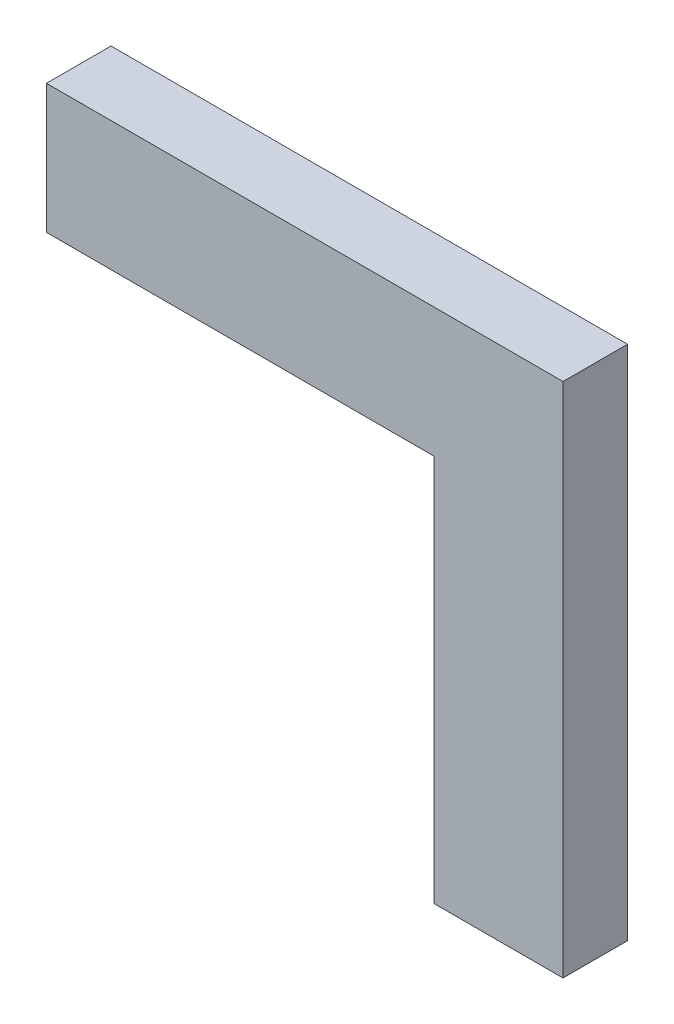
ISO-10303-21;
HEADER;
FILE_DESCRIPTION(('STEP AP214'),'2;1');
FILE_NAME('part.step','',(''),(''),'','','');
FILE_SCHEMA(('AUTOMOTIVE_DESIGN { 1 0 10303 214 1 1 1 1 }'));
ENDSEC;
DATA;
#1=APPLICATION_CONTEXT('core data for automotive mechanical design processes');
#2=APPLICATION_PROTOCOL_DEFINITION('international standard','automotive_design',2000,#1);
#3=PRODUCT_CONTEXT('',#1,'mechanical');
#4=PRODUCT('Part','Part','',(#3));
#5=PRODUCT_RELATED_PRODUCT_CATEGORY('part','',(#4));
#6=PRODUCT_DEFINITION_FORMATION('','',#4);
#7=PRODUCT_DEFINITION_CONTEXT('part definition',#1,'design');
#8=PRODUCT_DEFINITION('design','',#6,#7);
#9=PRODUCT_DEFINITION_SHAPE('','',#8);
#10=(LENGTH_UNIT() NAMED_UNIT(*) SI_UNIT(.MILLI.,.METRE.));
#11=(NAMED_UNIT(*) PLANE_ANGLE_UNIT() SI_UNIT($,.RADIAN.));
#12=(NAMED_UNIT(*) SI_UNIT($,.STERADIAN.) SOLID_ANGLE_UNIT());
#13=UNCERTAINTY_MEASURE_WITH_UNIT(LENGTH_MEASURE(1.E-05),#10,'distance_accuracy_value','');
#14=(GEOMETRIC_REPRESENTATION_CONTEXT(3) GLOBAL_UNCERTAINTY_ASSIGNED_CONTEXT((#13)) GLOBAL_UNIT_ASSIGNED_CONTEXT((#10,
#11,#12)) REPRESENTATION_CONTEXT('',''));
#15=CARTESIAN_POINT('',(0.,0.,0.));
#16=DIRECTION('',(0.,0.,1.));
#17=DIRECTION('',(1.,0.,0.));
#18=AXIS2_PLACEMENT_3D('',#15,#16,#17);
#19=CARTESIAN_POINT('',(-76.2,25.4,25.4));
#20=DIRECTION('',(1.,0.,0.));
#21=DIRECTION('',(0.,0.,-1.));
#22=AXIS2_PLACEMENT_3D('',#19,#20,#21);
#23=PLANE('',#22);
#24=DIRECTION('',(0.,-1.,0.));
#25=VECTOR('',#24,1.);
#26=CARTESIAN_POINT('',(-76.2,25.4,0.));
#27=LINE('',#26,#25);
#28=CARTESIAN_POINT('',(-76.2,25.4,0.));
#29=VERTEX_POINT('',#28);
#30=CARTESIAN_POINT('',(-76.2,-25.4,0.));
#31=VERTEX_POINT('',#30);
#32=EDGE_CURVE('E136',#29,#31,#27,.T.);
#33=ORIENTED_EDGE('',*,*,#32,.T.);
#34=DIRECTION('',(0.,0.,-1.));
#35=VECTOR('',#34,1.);
#36=CARTESIAN_POINT('',(-76.2,-25.4,25.4));
#37=LINE('',#36,#35);
#38=CARTESIAN_POINT('',(-76.2,-25.4,25.4));
#39=VERTEX_POINT('',#38);
#40=EDGE_CURVE('E11',#39,#31,#37,.T.);
#41=ORIENTED_EDGE('',*,*,#40,.F.);
#42=DIRECTION('',(0.,-1.,0.));
#43=VECTOR('',#42,1.);
#44=CARTESIAN_POINT('',(-76.2,25.4,25.4));
#45=LINE('',#44,#43);
#46=CARTESIAN_POINT('',(-76.2,25.4,25.4));
#47=VERTEX_POINT('',#46);
#48=EDGE_CURVE('E152',#47,#39,#45,.T.);
#49=ORIENTED_EDGE('',*,*,#48,.F.);
#50=DIRECTION('',(0.,0.,-1.));
#51=VECTOR('',#50,1.);
#52=CARTESIAN_POINT('',(-76.2,25.4,25.4));
#53=LINE('',#52,#51);
#54=EDGE_CURVE('E92',#47,#29,#53,.T.);
#55=ORIENTED_EDGE('',*,*,#54,.T.);
#56=EDGE_LOOP('',(#33,#41,#49,#55));
#57=FACE_BOUND('',#56,.T.);
#58=ADVANCED_FACE('F44',(#57),#23,.F.);
#59=CARTESIAN_POINT('',(-76.2,-25.4,25.4));
#60=DIRECTION('',(0.,1.,0.));
#61=DIRECTION('',(0.,0.,1.));
#62=AXIS2_PLACEMENT_3D('',#59,#60,#61);
#63=PLANE('',#62);
#64=DIRECTION('',(1.,0.,0.));
#65=VECTOR('',#64,1.);
#66=CARTESIAN_POINT('',(-76.2,-25.4,0.));
#67=LINE('',#66,#65);
#68=CARTESIAN_POINT('',(76.2,-25.4,0.));
#69=VERTEX_POINT('',#68);
#70=EDGE_CURVE('E139',#31,#69,#67,.T.);
#71=ORIENTED_EDGE('',*,*,#70,.T.);
#72=DIRECTION('',(0.,0.,-1.));
#73=VECTOR('',#72,1.);
#74=CARTESIAN_POINT('',(76.2,-25.4,25.4));
#75=LINE('',#74,#73);
#76=CARTESIAN_POINT('',(76.2,-25.4,25.4));
#77=VERTEX_POINT('',#76);
#78=EDGE_CURVE('E53',#77,#69,#75,.T.);
#79=ORIENTED_EDGE('',*,*,#78,.F.);
#80=DIRECTION('',(1.,0.,0.));
#81=VECTOR('',#80,1.);
#82=CARTESIAN_POINT('',(-76.2,-25.4,25.4));
#83=LINE('',#82,#81);
#84=EDGE_CURVE('E99',#39,#77,#83,.T.);
#85=ORIENTED_EDGE('',*,*,#84,.F.);
#86=ORIENTED_EDGE('',*,*,#40,.T.);
#87=EDGE_LOOP('',(#71,#79,#85,#86));
#88=FACE_BOUND('',#87,.T.);
#89=ADVANCED_FACE('F165',(#88),#63,.F.);
#90=CARTESIAN_POINT('',(76.2,-25.4,25.4));
#91=DIRECTION('',(1.,0.,0.));
#92=DIRECTION('',(0.,1.,0.));
#93=AXIS2_PLACEMENT_3D('',#90,#91,#92);
#94=PLANE('',#93);
#95=DIRECTION('',(0.,-1.,0.));
#96=VECTOR('',#95,1.);
#97=CARTESIAN_POINT('',(76.2,-25.4,0.));
#98=LINE('',#97,#96);
#99=CARTESIAN_POINT('',(76.2,-177.8,0.));
#100=VERTEX_POINT('',#99);
#101=EDGE_CURVE('E142',#69,#100,#98,.T.);
#102=ORIENTED_EDGE('',*,*,#101,.T.);
#103=DIRECTION('',(0.,0.,-1.));
#104=VECTOR('',#103,1.);
#105=CARTESIAN_POINT('',(76.2,-177.8,25.4));
#106=LINE('',#105,#104);
#107=CARTESIAN_POINT('',(76.2,-177.8,25.4));
#108=VERTEX_POINT('',#107);
#109=EDGE_CURVE('E126',#108,#100,#106,.T.);
#110=ORIENTED_EDGE('',*,*,#109,.F.);
#111=DIRECTION('',(0.,-1.,0.));
#112=VECTOR('',#111,1.);
#113=CARTESIAN_POINT('',(76.2,-25.4,25.4));
#114=LINE('',#113,#112);
#115=EDGE_CURVE('E112',#77,#108,#114,.T.);
#116=ORIENTED_EDGE('',*,*,#115,.F.);
#117=ORIENTED_EDGE('',*,*,#78,.T.);
#118=EDGE_LOOP('',(#102,#110,#116,#117));
#119=FACE_BOUND('',#118,.T.);
#120=ADVANCED_FACE('F162',(#119),#94,.F.);
#121=CARTESIAN_POINT('',(76.2,-177.8,25.4));
#122=DIRECTION('',(0.,1.,0.));
#123=DIRECTION('',(-1.,0.,0.));
#124=AXIS2_PLACEMENT_3D('',#121,#122,#123);
#125=PLANE('',#124);
#126=DIRECTION('',(1.,0.,0.));
#127=VECTOR('',#126,1.);
#128=CARTESIAN_POINT('',(76.2,-177.8,0.));
#129=LINE('',#128,#127);
#130=CARTESIAN_POINT('',(127.,-177.8,0.));
#131=VERTEX_POINT('',#130);
#132=EDGE_CURVE('E122',#100,#131,#129,.T.);
#133=ORIENTED_EDGE('',*,*,#132,.T.);
#134=DIRECTION('',(0.,0.,-1.));
#135=VECTOR('',#134,1.);
#136=CARTESIAN_POINT('',(127.,-177.8,25.4));
#137=LINE('',#136,#135);
#138=CARTESIAN_POINT('',(127.,-177.8,25.4));
#139=VERTEX_POINT('',#138);
#140=EDGE_CURVE('E119',#139,#131,#137,.T.);
#141=ORIENTED_EDGE('',*,*,#140,.F.);
#142=DIRECTION('',(1.,0.,0.));
#143=VECTOR('',#142,1.);
#144=CARTESIAN_POINT('',(76.2,-177.8,25.4));
#145=LINE('',#144,#143);
#146=EDGE_CURVE('E106',#108,#139,#145,.T.);
#147=ORIENTED_EDGE('',*,*,#146,.F.);
#148=ORIENTED_EDGE('',*,*,#109,.T.);
#149=EDGE_LOOP('',(#133,#141,#147,#148));
#150=FACE_BOUND('',#149,.T.);
#151=ADVANCED_FACE('F120',(#150),#125,.F.);
#152=CARTESIAN_POINT('',(127.,25.4,25.4));
#153=DIRECTION('',(1.,0.,0.));
#154=DIRECTION('',(0.,1.,0.));
#155=AXIS2_PLACEMENT_3D('',#152,#153,#154);
#156=PLANE('',#155);
#157=DIRECTION('',(0.,-1.,0.));
#158=VECTOR('',#157,1.);
#159=CARTESIAN_POINT('',(127.,25.4,0.));
#160=LINE('',#159,#158);
#161=CARTESIAN_POINT('',(127.,25.4,0.));
#162=VERTEX_POINT('',#161);
#163=EDGE_CURVE('E147',#162,#131,#160,.T.);
#164=ORIENTED_EDGE('',*,*,#163,.F.);
#165=DIRECTION('',(0.,0.,-1.));
#166=VECTOR('',#165,1.);
#167=CARTESIAN_POINT('',(127.,25.4,25.4));
#168=LINE('',#167,#166);
#169=CARTESIAN_POINT('',(127.,25.4,25.4));
#170=VERTEX_POINT('',#169);
#171=EDGE_CURVE('E127',#170,#162,#168,.T.);
#172=ORIENTED_EDGE('',*,*,#171,.F.);
#173=DIRECTION('',(0.,-1.,0.));
#174=VECTOR('',#173,1.);
#175=CARTESIAN_POINT('',(127.,25.4,25.4));
#176=LINE('',#175,#174);
#177=EDGE_CURVE('E110',#170,#139,#176,.T.);
#178=ORIENTED_EDGE('',*,*,#177,.T.);
#179=ORIENTED_EDGE('',*,*,#140,.T.);
#180=EDGE_LOOP('',(#164,#172,#178,#179));
#181=FACE_BOUND('',#180,.T.);
#182=ADVANCED_FACE('F129',(#181),#156,.T.);
#183=CARTESIAN_POINT('',(-76.2,25.4,25.4));
#184=DIRECTION('',(0.,1.,0.));
#185=DIRECTION('',(0.,0.,1.));
#186=AXIS2_PLACEMENT_3D('',#183,#184,#185);
#187=PLANE('',#186);
#188=DIRECTION('',(1.,0.,0.));
#189=VECTOR('',#188,1.);
#190=CARTESIAN_POINT('',(-76.2,25.4,0.));
#191=LINE('',#190,#189);
#192=EDGE_CURVE('E85',#29,#162,#191,.T.);
#193=ORIENTED_EDGE('',*,*,#192,.F.);
#194=ORIENTED_EDGE('',*,*,#54,.F.);
#195=DIRECTION('',(1.,0.,0.));
#196=VECTOR('',#195,1.);
#197=CARTESIAN_POINT('',(76.2,25.4,25.4));
#198=LINE('',#197,#196);
#199=EDGE_CURVE('E61',#47,#170,#198,.T.);
#200=ORIENTED_EDGE('',*,*,#199,.T.);
#201=ORIENTED_EDGE('',*,*,#171,.T.);
#202=EDGE_LOOP('',(#193,#194,#200,#201));
#203=FACE_BOUND('',#202,.T.);
#204=ADVANCED_FACE('F179',(#203),#187,.T.);
#205=CARTESIAN_POINT('',(0.,0.,25.4));
#206=DIRECTION('',(0.,0.,1.));
#207=DIRECTION('',(1.,0.,0.));
#208=AXIS2_PLACEMENT_3D('',#205,#206,#207);
#209=PLANE('',#208);
#210=ORIENTED_EDGE('',*,*,#48,.T.);
#211=ORIENTED_EDGE('',*,*,#84,.T.);
#212=ORIENTED_EDGE('',*,*,#115,.T.);
#213=ORIENTED_EDGE('',*,*,#146,.T.);
#214=ORIENTED_EDGE('',*,*,#177,.F.);
#215=ORIENTED_EDGE('',*,*,#199,.F.);
#216=EDGE_LOOP('',(#210,#211,#212,#213,#214,#215));
#217=FACE_BOUND('',#216,.T.);
#218=ADVANCED_FACE('F108',(#217),#209,.T.);
#219=CARTESIAN_POINT('',(0.,0.,0.));
#220=DIRECTION('',(0.,0.,1.));
#221=DIRECTION('',(1.,0.,0.));
#222=AXIS2_PLACEMENT_3D('',#219,#220,#221);
#223=PLANE('',#222);
#224=ORIENTED_EDGE('',*,*,#32,.F.);
#225=ORIENTED_EDGE('',*,*,#192,.T.);
#226=ORIENTED_EDGE('',*,*,#163,.T.);
#227=ORIENTED_EDGE('',*,*,#132,.F.);
#228=ORIENTED_EDGE('',*,*,#101,.F.);
#229=ORIENTED_EDGE('',*,*,#70,.F.);
#230=EDGE_LOOP('',(#224,#225,#226,#227,#228,#229));
#231=FACE_BOUND('',#230,.T.);
#232=ADVANCED_FACE('F163',(#231),#223,.F.);
#233=CLOSED_SHELL('',(#58,#89,#120,#151,#182,#204,#218,#232));
#234=MANIFOLD_SOLID_BREP('B2',#233);
#235=ADVANCED_BREP_SHAPE_REPRESENTATION('',(#18,#234),#14);
#236=SHAPE_DEFINITION_REPRESENTATION(#9,#235);
ENDSEC;
END-ISO-10303-21;
